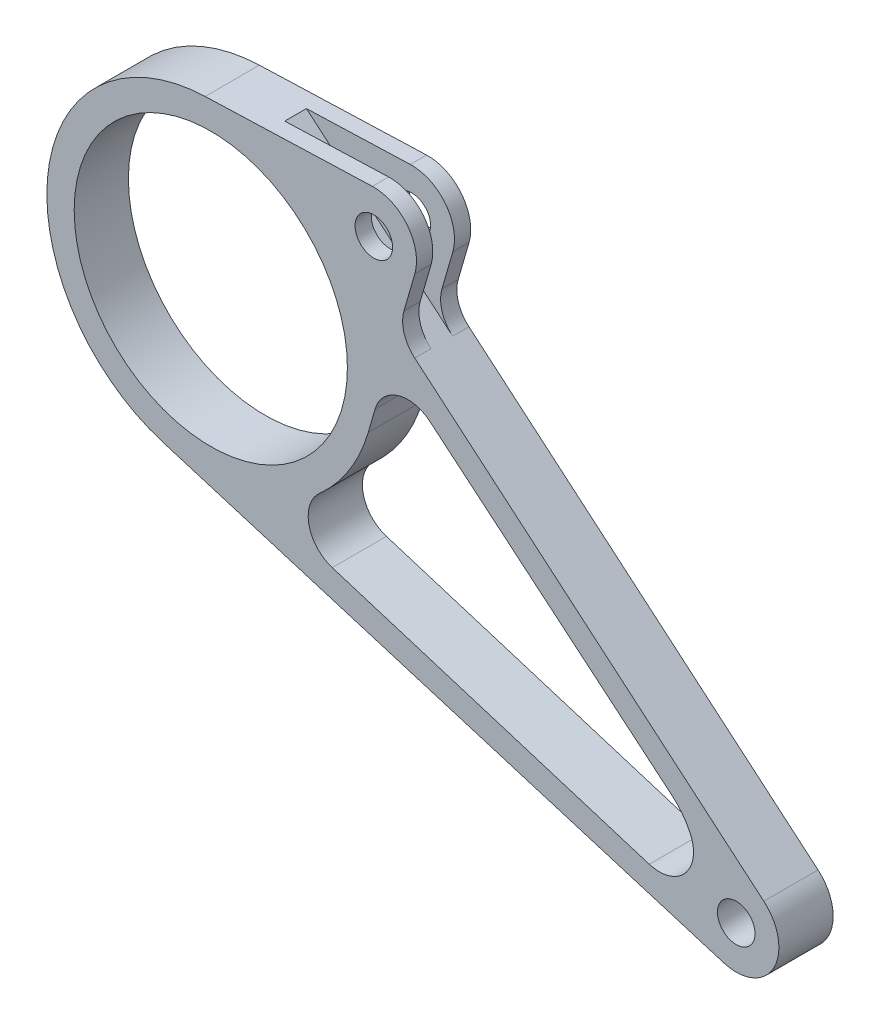
ISO-10303-21;
HEADER;
FILE_DESCRIPTION(('STEP AP214'),'2;1');
FILE_NAME('part.step','',(''),(''),'','','');
FILE_SCHEMA(('AUTOMOTIVE_DESIGN { 1 0 10303 214 1 1 1 1 }'));
ENDSEC;
DATA;
#1=APPLICATION_CONTEXT('core data for automotive mechanical design processes');
#2=APPLICATION_PROTOCOL_DEFINITION('international standard','automotive_design',2000,#1);
#3=PRODUCT_CONTEXT('',#1,'mechanical');
#4=PRODUCT('Part','Part','',(#3));
#5=PRODUCT_RELATED_PRODUCT_CATEGORY('part','',(#4));
#6=PRODUCT_DEFINITION_FORMATION('','',#4);
#7=PRODUCT_DEFINITION_CONTEXT('part definition',#1,'design');
#8=PRODUCT_DEFINITION('design','',#6,#7);
#9=PRODUCT_DEFINITION_SHAPE('','',#8);
#10=(LENGTH_UNIT() NAMED_UNIT(*) SI_UNIT(.MILLI.,.METRE.));
#11=(NAMED_UNIT(*) PLANE_ANGLE_UNIT() SI_UNIT($,.RADIAN.));
#12=(NAMED_UNIT(*) SI_UNIT($,.STERADIAN.) SOLID_ANGLE_UNIT());
#13=UNCERTAINTY_MEASURE_WITH_UNIT(LENGTH_MEASURE(1.E-05),#10,'distance_accuracy_value','');
#14=(GEOMETRIC_REPRESENTATION_CONTEXT(3) GLOBAL_UNCERTAINTY_ASSIGNED_CONTEXT((#13)) GLOBAL_UNIT_ASSIGNED_CONTEXT((#10,
#11,#12)) REPRESENTATION_CONTEXT('',''));
#15=CARTESIAN_POINT('',(0.,0.,0.));
#16=DIRECTION('',(0.,0.,1.));
#17=DIRECTION('',(1.,0.,0.));
#18=AXIS2_PLACEMENT_3D('',#15,#16,#17);
#19=CARTESIAN_POINT('',(-45.7927836164193,13.2841909151199,0.));
#20=DIRECTION('',(0.960405102550983,-0.278607320424348,0.));
#21=DIRECTION('',(0.278607320424348,0.960405102550984,0.));
#22=AXIS2_PLACEMENT_3D('',#19,#20,#21);
#23=PLANE('',#22);
#24=DIRECTION('',(0.,0.,1.));
#25=VECTOR('',#24,1.);
#26=CARTESIAN_POINT('',(-72.1062594431114,-77.4226735395391,0.));
#27=LINE('',#26,#25);
#28=CARTESIAN_POINT('',(-72.1062594431114,-77.4226735395391,15.875));
#29=VERTEX_POINT('',#28);
#30=CARTESIAN_POINT('',(-72.1062594431114,-77.4226735395391,11.1125));
#31=VERTEX_POINT('',#30);
#32=EDGE_CURVE('E393',#29,#31,#27,.F.);
#33=ORIENTED_EDGE('',*,*,#32,.T.);
#34=DIRECTION('',(0.278607320424348,0.960405102550984,0.));
#35=VECTOR('',#34,1.);
#36=CARTESIAN_POINT('',(-45.7927836164193,13.2841909151199,11.1125));
#37=LINE('',#36,#35);
#38=CARTESIAN_POINT('',(-68.9308464661694,-66.4765044973303,11.1125));
#39=VERTEX_POINT('',#38);
#40=EDGE_CURVE('E126',#31,#39,#37,.T.);
#41=ORIENTED_EDGE('',*,*,#40,.T.);
#42=DIRECTION('',(0.,0.,1.));
#43=VECTOR('',#42,1.);
#44=CARTESIAN_POINT('',(-68.9308464661694,-66.4765044973303,0.));
#45=LINE('',#44,#43);
#46=CARTESIAN_POINT('',(-68.9308464661694,-66.4765044973303,15.875));
#47=VERTEX_POINT('',#46);
#48=EDGE_CURVE('E327',#39,#47,#45,.T.);
#49=ORIENTED_EDGE('',*,*,#48,.T.);
#50=DIRECTION('',(0.278607320424348,0.960405102550983,0.));
#51=VECTOR('',#50,1.);
#52=CARTESIAN_POINT('',(-45.7927836164193,13.2841909151199,15.875));
#53=LINE('',#52,#51);
#54=EDGE_CURVE('E313',#29,#47,#53,.T.);
#55=ORIENTED_EDGE('',*,*,#54,.F.);
#56=EDGE_LOOP('',(#33,#41,#49,#55));
#57=FACE_BOUND('',#56,.T.);
#58=ADVANCED_FACE('F111',(#57),#23,.T.);
#59=CARTESIAN_POINT('',(-80.9359102480567,-62.9939129920259,0.));
#60=DIRECTION('',(0.,0.,1.));
#61=DIRECTION('',(1.,0.,0.));
#62=AXIS2_PLACEMENT_3D('',#59,#60,#61);
#63=CYLINDRICAL_SURFACE('',#62,12.5);
#64=ORIENTED_EDGE('',*,*,#48,.F.);
#65=CARTESIAN_POINT('',(-80.9359102480567,-62.9939129920259,11.1125));
#66=DIRECTION('',(0.,0.,-1.));
#67=DIRECTION('',(-1.,0.,0.));
#68=AXIS2_PLACEMENT_3D('',#65,#66,#67);
#69=CIRCLE('',#68,12.5);
#70=CARTESIAN_POINT('',(-81.36466756333,-50.5012684695639,11.1125));
#71=VERTEX_POINT('',#70);
#72=EDGE_CURVE('E281',#71,#39,#69,.T.);
#73=ORIENTED_EDGE('',*,*,#72,.F.);
#74=DIRECTION('',(0.,0.,1.));
#75=VECTOR('',#74,1.);
#76=CARTESIAN_POINT('',(-81.36466756333,-50.5012684695639,0.));
#77=LINE('',#76,#75);
#78=CARTESIAN_POINT('',(-81.36466756333,-50.5012684695639,15.875));
#79=VERTEX_POINT('',#78);
#80=EDGE_CURVE('E307',#71,#79,#77,.T.);
#81=ORIENTED_EDGE('',*,*,#80,.T.);
#82=CARTESIAN_POINT('',(-80.9359102480567,-62.9939129920259,15.875));
#83=DIRECTION('',(0.,0.,1.));
#84=DIRECTION('',(1.,0.,0.));
#85=AXIS2_PLACEMENT_3D('',#82,#83,#84);
#86=CIRCLE('',#85,12.5);
#87=EDGE_CURVE('E310',#79,#47,#86,.F.);
#88=ORIENTED_EDGE('',*,*,#87,.T.);
#89=EDGE_LOOP('',(#64,#73,#81,#88));
#90=FACE_BOUND('',#89,.T.);
#91=ADVANCED_FACE('F474',(#90),#63,.T.);
#92=CARTESIAN_POINT('',(-80.9359102480567,-62.9939129920259,0.));
#93=DIRECTION('',(0.,0.,1.));
#94=DIRECTION('',(1.,0.,0.));
#95=AXIS2_PLACEMENT_3D('',#92,#93,#94);
#96=CYLINDRICAL_SURFACE('',#95,5.5);
#97=CARTESIAN_POINT('',(-80.9359102480567,-62.9939129920259,15.875));
#98=DIRECTION('',(0.,0.,1.));
#99=DIRECTION('',(1.,0.,0.));
#100=AXIS2_PLACEMENT_3D('',#97,#98,#99);
#101=CIRCLE('',#100,5.5);
#102=CARTESIAN_POINT('',(-75.4359102480567,-62.9939129920259,15.875));
#103=VERTEX_POINT('',#102);
#104=EDGE_CURVE('E320',#103,#103,#101,.T.);
#105=ORIENTED_EDGE('',*,*,#104,.T.);
#106=EDGE_LOOP('',(#105));
#107=FACE_BOUND('',#106,.T.);
#108=CARTESIAN_POINT('',(-80.9359102480567,-62.9939129920259,11.1125));
#109=DIRECTION('',(0.,0.,-1.));
#110=DIRECTION('',(-1.,0.,0.));
#111=AXIS2_PLACEMENT_3D('',#108,#109,#110);
#112=CIRCLE('',#111,5.5);
#113=CARTESIAN_POINT('',(-86.4359102480567,-62.9939129920259,11.1125));
#114=VERTEX_POINT('',#113);
#115=EDGE_CURVE('E287',#114,#114,#112,.F.);
#116=ORIENTED_EDGE('',*,*,#115,.F.);
#117=EDGE_LOOP('',(#116));
#118=FACE_BOUND('',#117,.T.);
#119=ADVANCED_FACE('F482',(#107,#118),#96,.F.);
#120=CARTESIAN_POINT('',(-62.5022084176016,-80.2087467437826,0.));
#121=DIRECTION('',(0.,0.,1.));
#122=DIRECTION('',(1.,0.,0.));
#123=AXIS2_PLACEMENT_3D('',#120,#121,#122);
#124=CYLINDRICAL_SURFACE('',#123,10.);
#125=CARTESIAN_POINT('',(-62.5022084176016,-80.2087467437826,11.1125));
#126=DIRECTION('',(0.,0.,-1.));
#127=DIRECTION('',(-1.,0.,0.));
#128=AXIS2_PLACEMENT_3D('',#125,#126,#127);
#129=CIRCLE('',#128,10.);
#130=CARTESIAN_POINT('',(-68.9673127316795,-87.8377982056677,11.1125));
#131=VERTEX_POINT('',#130);
#132=EDGE_CURVE('E119',#31,#131,#129,.F.);
#133=ORIENTED_EDGE('',*,*,#132,.F.);
#134=ORIENTED_EDGE('',*,*,#32,.F.);
#135=CARTESIAN_POINT('',(-62.5022084176016,-80.2087467437826,15.875));
#136=DIRECTION('',(0.,0.,1.));
#137=DIRECTION('',(1.,0.,0.));
#138=AXIS2_PLACEMENT_3D('',#135,#136,#137);
#139=CIRCLE('',#138,10.);
#140=CARTESIAN_POINT('',(-68.9673127316795,-87.8377982056677,15.875));
#141=VERTEX_POINT('',#140);
#142=EDGE_CURVE('E407',#141,#29,#139,.F.);
#143=ORIENTED_EDGE('',*,*,#142,.F.);
#144=DIRECTION('',(0.,0.,1.));
#145=VECTOR('',#144,1.);
#146=CARTESIAN_POINT('',(-68.9673127316795,-87.8377982056677,0.));
#147=LINE('',#146,#145);
#148=EDGE_CURVE('E390',#131,#141,#147,.T.);
#149=ORIENTED_EDGE('',*,*,#148,.F.);
#150=EDGE_LOOP('',(#133,#134,#143,#149));
#151=FACE_BOUND('',#150,.T.);
#152=ADVANCED_FACE('F441',(#151),#124,.F.);
#153=CARTESIAN_POINT('',(-128.679206861492,-100.153402069267,15.875));
#154=DIRECTION('',(0.,0.,1.));
#155=DIRECTION('',(1.,0.,0.));
#156=AXIS2_PLACEMENT_3D('',#153,#154,#155);
#157=PLANE('',#156);
#158=ORIENTED_EDGE('',*,*,#104,.F.);
#159=EDGE_LOOP('',(#158));
#160=FACE_BOUND('',#159,.T.);
#161=DIRECTION('',(-0.766657695712818,0.642056054877074,0.));
#162=VECTOR('',#161,1.);
#163=CARTESIAN_POINT('',(-76.6631882052993,-91.5409531130822,15.875));
#164=LINE('',#163,#162);
#165=CARTESIAN_POINT('',(6.41120908182552,-161.113619091305,15.875));
#166=VERTEX_POINT('',#165);
#167=CARTESIAN_POINT('',(-64.5386730776667,-101.694921949079,15.875));
#168=VERTEX_POINT('',#167);
#169=EDGE_CURVE('E333',#166,#168,#164,.T.);
#170=ORIENTED_EDGE('',*,*,#169,.F.);
#171=CARTESIAN_POINT('',(-6.429912015716,-176.446773005562,15.875));
#172=DIRECTION('',(0.,0.,1.));
#173=DIRECTION('',(1.,0.,0.));
#174=AXIS2_PLACEMENT_3D('',#171,#172,#173);
#175=CIRCLE('',#174,20.);
#176=CARTESIAN_POINT('',(11.7808813856509,-168.178338831383,15.875));
#177=VERTEX_POINT('',#176);
#178=EDGE_CURVE('E424',#166,#177,#175,.F.);
#179=ORIENTED_EDGE('',*,*,#178,.T.);
#180=CARTESIAN_POINT('',(2.67548468496747,-172.312555918472,15.875));
#181=DIRECTION('',(0.,0.,1.));
#182=DIRECTION('',(1.,0.,0.));
#183=AXIS2_PLACEMENT_3D('',#180,#181,#182);
#184=CIRCLE('',#183,10.);
#185=CARTESIAN_POINT('',(-0.287414255686937,-181.863536489464,15.875));
#186=VERTEX_POINT('',#185);
#187=EDGE_CURVE('E134',#177,#186,#184,.F.);
#188=ORIENTED_EDGE('',*,*,#187,.T.);
#189=DIRECTION('',(-0.955098057099212,0.296289894065441,0.));
#190=VECTOR('',#189,1.);
#191=CARTESIAN_POINT('',(-51.4900483803203,-165.979488848602,15.875));
#192=LINE('',#191,#190);
#193=CARTESIAN_POINT('',(-93.1209818700245,-153.064767913065,15.875));
#194=VERTEX_POINT('',#193);
#195=EDGE_CURVE('E339',#186,#194,#192,.T.);
#196=ORIENTED_EDGE('',*,*,#195,.T.);
#197=CARTESIAN_POINT('',(-90.1580829293701,-143.513787342073,15.875));
#198=DIRECTION('',(0.,0.,1.));
#199=DIRECTION('',(1.,0.,0.));
#200=AXIS2_PLACEMENT_3D('',#197,#198,#199);
#201=CIRCLE('',#200,10.);
#202=CARTESIAN_POINT('',(-96.7996560211152,-136.037858846761,15.875));
#203=VERTEX_POINT('',#202);
#204=EDGE_CURVE('E416',#194,#203,#201,.F.);
#205=ORIENTED_EDGE('',*,*,#204,.T.);
#206=CARTESIAN_POINT('',(-128.679206861492,-100.153402069267,15.875));
#207=DIRECTION('',(0.,0.,1.));
#208=DIRECTION('',(1.,0.,0.));
#209=AXIS2_PLACEMENT_3D('',#206,#207,#208);
#210=CIRCLE('',#209,48.0000000000003);
#211=CARTESIAN_POINT('',(-82.5797619390443,-113.526553449636,15.875));
#212=VERTEX_POINT('',#211);
#213=EDGE_CURVE('E351',#203,#212,#210,.T.);
#214=ORIENTED_EDGE('',*,*,#213,.T.);
#215=DIRECTION('',(0.278607320424348,0.960405102550983,0.));
#216=VECTOR('',#215,1.);
#217=CARTESIAN_POINT('',(-45.7927836164193,13.2841909151199,15.875));
#218=LINE('',#217,#216);
#219=CARTESIAN_POINT('',(-80.5632846519473,-106.575425701964,15.875));
#220=VERTEX_POINT('',#219);
#221=EDGE_CURVE('E348',#212,#220,#218,.T.);
#222=ORIENTED_EDGE('',*,*,#221,.T.);
#223=CARTESIAN_POINT('',(-70.9592336264375,-109.361498906207,15.875));
#224=DIRECTION('',(0.,0.,1.));
#225=DIRECTION('',(1.,0.,0.));
#226=AXIS2_PLACEMENT_3D('',#223,#224,#225);
#227=CIRCLE('',#226,10.);
#228=EDGE_CURVE('E411',#220,#168,#227,.F.);
#229=ORIENTED_EDGE('',*,*,#228,.T.);
#230=EDGE_LOOP('',(#170,#179,#188,#196,#205,#214,#222,#229));
#231=FACE_BOUND('',#230,.T.);
#232=CARTESIAN_POINT('',(25.178967194243,-184.005129645085,15.875));
#233=DIRECTION('',(0.,0.,1.));
#234=DIRECTION('',(1.,0.,0.));
#235=AXIS2_PLACEMENT_3D('',#232,#233,#234);
#236=CIRCLE('',#235,5.5);
#237=CARTESIAN_POINT('',(30.678967194243,-184.005129645085,15.875));
#238=VERTEX_POINT('',#237);
#239=EDGE_CURVE('E357',#238,#238,#236,.T.);
#240=ORIENTED_EDGE('',*,*,#239,.F.);
#241=EDGE_LOOP('',(#240));
#242=FACE_BOUND('',#241,.T.);
#243=CARTESIAN_POINT('',(-128.679206861492,-100.153402069267,15.875));
#244=DIRECTION('',(0.,0.,1.));
#245=DIRECTION('',(1.,0.,0.));
#246=AXIS2_PLACEMENT_3D('',#243,#244,#245);
#247=CIRCLE('',#246,40.);
#248=CARTESIAN_POINT('',(-88.6792068614918,-100.153402069267,15.875));
#249=VERTEX_POINT('',#248);
#250=EDGE_CURVE('E363',#249,#249,#247,.T.);
#251=ORIENTED_EDGE('',*,*,#250,.F.);
#252=EDGE_LOOP('',(#251));
#253=FACE_BOUND('',#252,.T.);
#254=DIRECTION('',(0.999411561796959,0.034300585221869,0.));
#255=VECTOR('',#254,1.);
#256=CARTESIAN_POINT('',(1.63547577247302,-47.6526387370859,15.875));
#257=LINE('',#256,#255);
#258=CARTESIAN_POINT('',(-130.325634952142,-52.1816471030125,15.875));
#259=VERTEX_POINT('',#258);
#260=EDGE_CURVE('E295',#259,#79,#257,.T.);
#261=ORIENTED_EDGE('',*,*,#260,.F.);
#262=CARTESIAN_POINT('',(-128.679206861492,-100.153402069267,15.875));
#263=DIRECTION('',(0.,0.,1.));
#264=DIRECTION('',(1.,0.,0.));
#265=AXIS2_PLACEMENT_3D('',#262,#263,#264);
#266=CIRCLE('',#265,48.0000000000003);
#267=CARTESIAN_POINT('',(-142.633865887239,-146.080164326967,15.875));
#268=VERTEX_POINT('',#267);
#269=EDGE_CURVE('E369',#259,#268,#266,.T.);
#270=ORIENTED_EDGE('',*,*,#269,.T.);
#271=DIRECTION('',(0.956807547035381,-0.290722063036393,0.));
#272=VECTOR('',#271,1.);
#273=CARTESIAN_POINT('',(-142.633865887239,-146.080164326967,15.875));
#274=LINE('',#273,#272);
#275=CARTESIAN_POINT('',(21.5449414062881,-195.965223983027,15.875));
#276=VERTEX_POINT('',#275);
#277=EDGE_CURVE('E372',#268,#276,#274,.T.);
#278=ORIENTED_EDGE('',*,*,#277,.T.);
#279=CARTESIAN_POINT('',(25.178967194243,-184.005129645085,15.875));
#280=DIRECTION('',(0.,0.,1.));
#281=DIRECTION('',(1.,0.,0.));
#282=AXIS2_PLACEMENT_3D('',#279,#280,#281);
#283=CIRCLE('',#282,12.5);
#284=CARTESIAN_POINT('',(33.2603475868405,-174.468815317728,15.875));
#285=VERTEX_POINT('',#284);
#286=EDGE_CURVE('E375',#276,#285,#283,.T.);
#287=ORIENTED_EDGE('',*,*,#286,.T.);
#288=DIRECTION('',(0.762905146188508,-0.646510431407793,0.));
#289=VECTOR('',#288,1.);
#290=CARTESIAN_POINT('',(-72.1505611635108,-85.1402107962456,15.875));
#291=LINE('',#290,#289);
#292=EDGE_CURVE('E300',#141,#285,#291,.T.);
#293=ORIENTED_EDGE('',*,*,#292,.F.);
#294=ORIENTED_EDGE('',*,*,#142,.T.);
#295=ORIENTED_EDGE('',*,*,#54,.T.);
#296=ORIENTED_EDGE('',*,*,#87,.F.);
#297=EDGE_LOOP('',(#261,#270,#278,#287,#293,#294,#295,#296));
#298=FACE_BOUND('',#297,.T.);
#299=ADVANCED_FACE('F446',(#160,#231,#242,#253,#298),#157,.T.);
#300=CARTESIAN_POINT('',(-128.679206861492,-100.153402069267,0.));
#301=DIRECTION('',(0.,0.,1.));
#302=DIRECTION('',(1.,0.,0.));
#303=AXIS2_PLACEMENT_3D('',#300,#301,#302);
#304=PLANE('',#303);
#305=CARTESIAN_POINT('',(-80.9359102480567,-62.9939129920259,0.));
#306=DIRECTION('',(0.,0.,1.));
#307=DIRECTION('',(1.,0.,0.));
#308=AXIS2_PLACEMENT_3D('',#305,#306,#307);
#309=CIRCLE('',#308,5.5);
#310=CARTESIAN_POINT('',(-75.4359102480567,-62.9939129920259,0.));
#311=VERTEX_POINT('',#310);
#312=EDGE_CURVE('E330',#311,#311,#309,.T.);
#313=ORIENTED_EDGE('',*,*,#312,.T.);
#314=EDGE_LOOP('',(#313));
#315=FACE_BOUND('',#314,.T.);
#316=DIRECTION('',(-0.955098057099212,0.296289894065441,0.));
#317=VECTOR('',#316,1.);
#318=CARTESIAN_POINT('',(-51.4900483803203,-165.979488848602,0.));
#319=LINE('',#318,#317);
#320=CARTESIAN_POINT('',(-0.287414255686937,-181.863536489464,0.));
#321=VERTEX_POINT('',#320);
#322=CARTESIAN_POINT('',(-93.1209818700245,-153.064767913065,0.));
#323=VERTEX_POINT('',#322);
#324=EDGE_CURVE('E344',#321,#323,#319,.T.);
#325=ORIENTED_EDGE('',*,*,#324,.F.);
#326=CARTESIAN_POINT('',(2.67548468496747,-172.312555918472,0.));
#327=DIRECTION('',(0.,0.,1.));
#328=DIRECTION('',(1.,0.,0.));
#329=AXIS2_PLACEMENT_3D('',#326,#327,#328);
#330=CIRCLE('',#329,10.);
#331=CARTESIAN_POINT('',(11.7808813856509,-168.178338831383,0.));
#332=VERTEX_POINT('',#331);
#333=EDGE_CURVE('E434',#321,#332,#330,.T.);
#334=ORIENTED_EDGE('',*,*,#333,.T.);
#335=CARTESIAN_POINT('',(-6.429912015716,-176.446773005562,0.));
#336=DIRECTION('',(0.,0.,1.));
#337=DIRECTION('',(1.,0.,0.));
#338=AXIS2_PLACEMENT_3D('',#335,#336,#337);
#339=CIRCLE('',#338,20.);
#340=CARTESIAN_POINT('',(6.41120908182552,-161.113619091305,0.));
#341=VERTEX_POINT('',#340);
#342=EDGE_CURVE('E426',#332,#341,#339,.T.);
#343=ORIENTED_EDGE('',*,*,#342,.T.);
#344=DIRECTION('',(-0.766657695712818,0.642056054877074,0.));
#345=VECTOR('',#344,1.);
#346=CARTESIAN_POINT('',(-76.6631882052993,-91.5409531130822,0.));
#347=LINE('',#346,#345);
#348=CARTESIAN_POINT('',(-64.5386730776667,-101.694921949079,0.));
#349=VERTEX_POINT('',#348);
#350=EDGE_CURVE('E336',#341,#349,#347,.T.);
#351=ORIENTED_EDGE('',*,*,#350,.T.);
#352=CARTESIAN_POINT('',(-70.9592336264375,-109.361498906207,0.));
#353=DIRECTION('',(0.,0.,1.));
#354=DIRECTION('',(1.,0.,0.));
#355=AXIS2_PLACEMENT_3D('',#352,#353,#354);
#356=CIRCLE('',#355,10.);
#357=CARTESIAN_POINT('',(-80.5632846519473,-106.575425701964,0.));
#358=VERTEX_POINT('',#357);
#359=EDGE_CURVE('E414',#349,#358,#356,.T.);
#360=ORIENTED_EDGE('',*,*,#359,.T.);
#361=DIRECTION('',(0.278607320424348,0.960405102550983,0.));
#362=VECTOR('',#361,1.);
#363=CARTESIAN_POINT('',(-45.7927836164193,13.2841909151199,0.));
#364=LINE('',#363,#362);
#365=CARTESIAN_POINT('',(-82.5797619390443,-113.526553449636,0.));
#366=VERTEX_POINT('',#365);
#367=EDGE_CURVE('E338',#366,#358,#364,.T.);
#368=ORIENTED_EDGE('',*,*,#367,.F.);
#369=CARTESIAN_POINT('',(-128.679206861492,-100.153402069267,0.));
#370=DIRECTION('',(0.,0.,1.));
#371=DIRECTION('',(1.,0.,0.));
#372=AXIS2_PLACEMENT_3D('',#369,#370,#371);
#373=CIRCLE('',#372,48.0000000000003);
#374=CARTESIAN_POINT('',(-96.7996560211152,-136.037858846761,0.));
#375=VERTEX_POINT('',#374);
#376=EDGE_CURVE('E342',#375,#366,#373,.T.);
#377=ORIENTED_EDGE('',*,*,#376,.F.);
#378=CARTESIAN_POINT('',(-90.1580829293701,-143.513787342073,0.));
#379=DIRECTION('',(0.,0.,1.));
#380=DIRECTION('',(1.,0.,0.));
#381=AXIS2_PLACEMENT_3D('',#378,#379,#380);
#382=CIRCLE('',#381,10.);
#383=EDGE_CURVE('E418',#375,#323,#382,.T.);
#384=ORIENTED_EDGE('',*,*,#383,.T.);
#385=EDGE_LOOP('',(#325,#334,#343,#351,#360,#368,#377,#384));
#386=FACE_BOUND('',#385,.T.);
#387=CARTESIAN_POINT('',(-128.679206861492,-100.153402069267,0.));
#388=DIRECTION('',(0.,0.,1.));
#389=DIRECTION('',(1.,0.,0.));
#390=AXIS2_PLACEMENT_3D('',#387,#388,#389);
#391=CIRCLE('',#390,40.);
#392=CARTESIAN_POINT('',(-88.6792068614918,-100.153402069267,0.));
#393=VERTEX_POINT('',#392);
#394=EDGE_CURVE('E360',#393,#393,#391,.T.);
#395=ORIENTED_EDGE('',*,*,#394,.T.);
#396=EDGE_LOOP('',(#395));
#397=FACE_BOUND('',#396,.T.);
#398=CARTESIAN_POINT('',(25.178967194243,-184.005129645085,0.));
#399=DIRECTION('',(0.,0.,1.));
#400=DIRECTION('',(1.,0.,0.));
#401=AXIS2_PLACEMENT_3D('',#398,#399,#400);
#402=CIRCLE('',#401,5.5);
#403=CARTESIAN_POINT('',(30.678967194243,-184.005129645085,0.));
#404=VERTEX_POINT('',#403);
#405=EDGE_CURVE('E356',#404,#404,#402,.T.);
#406=ORIENTED_EDGE('',*,*,#405,.T.);
#407=EDGE_LOOP('',(#406));
#408=FACE_BOUND('',#407,.T.);
#409=CARTESIAN_POINT('',(-128.679206861492,-100.153402069267,0.));
#410=DIRECTION('',(0.,0.,1.));
#411=DIRECTION('',(1.,0.,0.));
#412=AXIS2_PLACEMENT_3D('',#409,#410,#411);
#413=CIRCLE('',#412,48.0000000000003);
#414=CARTESIAN_POINT('',(-130.325634952142,-52.1816471030125,0.));
#415=VERTEX_POINT('',#414);
#416=CARTESIAN_POINT('',(-142.633865887239,-146.080164326967,0.));
#417=VERTEX_POINT('',#416);
#418=EDGE_CURVE('E366',#415,#417,#413,.T.);
#419=ORIENTED_EDGE('',*,*,#418,.F.);
#420=DIRECTION('',(0.999411561796959,0.034300585221869,0.));
#421=VECTOR('',#420,1.);
#422=CARTESIAN_POINT('',(1.63547577247302,-47.6526387370859,0.));
#423=LINE('',#422,#421);
#424=CARTESIAN_POINT('',(-81.36466756333,-50.5012684695639,0.));
#425=VERTEX_POINT('',#424);
#426=EDGE_CURVE('E296',#415,#425,#423,.T.);
#427=ORIENTED_EDGE('',*,*,#426,.T.);
#428=CARTESIAN_POINT('',(-80.9359102480567,-62.9939129920259,0.));
#429=DIRECTION('',(0.,0.,1.));
#430=DIRECTION('',(1.,0.,0.));
#431=AXIS2_PLACEMENT_3D('',#428,#429,#430);
#432=CIRCLE('',#431,12.5);
#433=CARTESIAN_POINT('',(-68.9308464661694,-66.4765044973303,0.));
#434=VERTEX_POINT('',#433);
#435=EDGE_CURVE('E299',#425,#434,#432,.F.);
#436=ORIENTED_EDGE('',*,*,#435,.T.);
#437=DIRECTION('',(0.278607320424348,0.960405102550983,0.));
#438=VECTOR('',#437,1.);
#439=CARTESIAN_POINT('',(-45.7927836164193,13.2841909151199,0.));
#440=LINE('',#439,#438);
#441=CARTESIAN_POINT('',(-72.1062594431114,-77.4226735395391,0.));
#442=VERTEX_POINT('',#441);
#443=EDGE_CURVE('E303',#442,#434,#440,.T.);
#444=ORIENTED_EDGE('',*,*,#443,.F.);
#445=CARTESIAN_POINT('',(-62.5022084176016,-80.2087467437826,0.));
#446=DIRECTION('',(0.,0.,1.));
#447=DIRECTION('',(1.,0.,0.));
#448=AXIS2_PLACEMENT_3D('',#445,#446,#447);
#449=CIRCLE('',#448,10.);
#450=CARTESIAN_POINT('',(-68.9673127316795,-87.8377982056677,0.));
#451=VERTEX_POINT('',#450);
#452=EDGE_CURVE('E409',#442,#451,#449,.T.);
#453=ORIENTED_EDGE('',*,*,#452,.T.);
#454=DIRECTION('',(0.762905146188508,-0.646510431407793,0.));
#455=VECTOR('',#454,1.);
#456=CARTESIAN_POINT('',(-72.1505611635108,-85.1402107962456,0.));
#457=LINE('',#456,#455);
#458=CARTESIAN_POINT('',(33.2603475868405,-174.468815317728,0.));
#459=VERTEX_POINT('',#458);
#460=EDGE_CURVE('E305',#451,#459,#457,.T.);
#461=ORIENTED_EDGE('',*,*,#460,.T.);
#462=CARTESIAN_POINT('',(25.178967194243,-184.005129645085,0.));
#463=DIRECTION('',(0.,0.,1.));
#464=DIRECTION('',(1.,0.,0.));
#465=AXIS2_PLACEMENT_3D('',#462,#463,#464);
#466=CIRCLE('',#465,12.5);
#467=CARTESIAN_POINT('',(21.5449414062881,-195.965223983027,0.));
#468=VERTEX_POINT('',#467);
#469=EDGE_CURVE('E373',#468,#459,#466,.T.);
#470=ORIENTED_EDGE('',*,*,#469,.F.);
#471=DIRECTION('',(0.956807547035381,-0.290722063036393,0.));
#472=VECTOR('',#471,1.);
#473=CARTESIAN_POINT('',(-142.633865887239,-146.080164326967,0.));
#474=LINE('',#473,#472);
#475=EDGE_CURVE('E381',#417,#468,#474,.T.);
#476=ORIENTED_EDGE('',*,*,#475,.F.);
#477=EDGE_LOOP('',(#419,#427,#436,#444,#453,#461,#470,#476));
#478=FACE_BOUND('',#477,.T.);
#479=ADVANCED_FACE('F454',(#315,#386,#397,#408,#478),#304,.F.);
#480=CARTESIAN_POINT('',(-128.679206861492,-100.153402069267,15.875));
#481=DIRECTION('',(0.,0.,-1.));
#482=DIRECTION('',(-1.,0.,0.));
#483=AXIS2_PLACEMENT_3D('',#480,#481,#482);
#484=CYLINDRICAL_SURFACE('',#483,48.0000000000003);
#485=ORIENTED_EDGE('',*,*,#418,.T.);
#486=DIRECTION('',(0.,0.,-1.));
#487=VECTOR('',#486,1.);
#488=CARTESIAN_POINT('',(-142.633865887239,-146.080164326967,15.875));
#489=LINE('',#488,#487);
#490=EDGE_CURVE('E387',#268,#417,#489,.T.);
#491=ORIENTED_EDGE('',*,*,#490,.F.);
#492=ORIENTED_EDGE('',*,*,#269,.F.);
#493=DIRECTION('',(0.,0.,1.));
#494=VECTOR('',#493,1.);
#495=CARTESIAN_POINT('',(-130.325634952142,-52.1816471030125,0.));
#496=LINE('',#495,#494);
#497=EDGE_CURVE('E317',#415,#259,#496,.T.);
#498=ORIENTED_EDGE('',*,*,#497,.F.);
#499=EDGE_LOOP('',(#485,#491,#492,#498));
#500=FACE_BOUND('',#499,.T.);
#501=ADVANCED_FACE('F568',(#500),#484,.T.);
#502=CARTESIAN_POINT('',(-142.633865887239,-146.080164326967,15.875));
#503=DIRECTION('',(0.290722063036393,0.956807547035381,0.));
#504=DIRECTION('',(-0.956807547035382,0.290722063036393,0.));
#505=AXIS2_PLACEMENT_3D('',#502,#503,#504);
#506=PLANE('',#505);
#507=ORIENTED_EDGE('',*,*,#475,.T.);
#508=DIRECTION('',(0.,0.,-1.));
#509=VECTOR('',#508,1.);
#510=CARTESIAN_POINT('',(21.5449414062881,-195.965223983027,15.875));
#511=LINE('',#510,#509);
#512=EDGE_CURVE('E378',#276,#468,#511,.T.);
#513=ORIENTED_EDGE('',*,*,#512,.F.);
#514=ORIENTED_EDGE('',*,*,#277,.F.);
#515=ORIENTED_EDGE('',*,*,#490,.T.);
#516=EDGE_LOOP('',(#507,#513,#514,#515));
#517=FACE_BOUND('',#516,.T.);
#518=ADVANCED_FACE('F572',(#517),#506,.F.);
#519=CARTESIAN_POINT('',(25.178967194243,-184.005129645085,15.875));
#520=DIRECTION('',(0.,0.,-1.));
#521=DIRECTION('',(-1.,0.,0.));
#522=AXIS2_PLACEMENT_3D('',#519,#520,#521);
#523=CYLINDRICAL_SURFACE('',#522,12.5);
#524=ORIENTED_EDGE('',*,*,#469,.T.);
#525=DIRECTION('',(0.,0.,1.));
#526=VECTOR('',#525,1.);
#527=CARTESIAN_POINT('',(33.2603475868405,-174.468815317728,0.));
#528=LINE('',#527,#526);
#529=EDGE_CURVE('E321',#459,#285,#528,.T.);
#530=ORIENTED_EDGE('',*,*,#529,.T.);
#531=ORIENTED_EDGE('',*,*,#286,.F.);
#532=ORIENTED_EDGE('',*,*,#512,.T.);
#533=EDGE_LOOP('',(#524,#530,#531,#532));
#534=FACE_BOUND('',#533,.T.);
#535=ADVANCED_FACE('F450',(#534),#523,.T.);
#536=CARTESIAN_POINT('',(-128.679206861492,-100.153402069267,15.875));
#537=DIRECTION('',(0.,0.,-1.));
#538=DIRECTION('',(-1.,0.,0.));
#539=AXIS2_PLACEMENT_3D('',#536,#537,#538);
#540=CYLINDRICAL_SURFACE('',#539,40.);
#541=ORIENTED_EDGE('',*,*,#250,.T.);
#542=EDGE_LOOP('',(#541));
#543=FACE_BOUND('',#542,.T.);
#544=ORIENTED_EDGE('',*,*,#394,.F.);
#545=EDGE_LOOP('',(#544));
#546=FACE_BOUND('',#545,.T.);
#547=ADVANCED_FACE('F558',(#543,#546),#540,.F.);
#548=CARTESIAN_POINT('',(25.178967194243,-184.005129645085,15.875));
#549=DIRECTION('',(0.,0.,-1.));
#550=DIRECTION('',(-1.,0.,0.));
#551=AXIS2_PLACEMENT_3D('',#548,#549,#550);
#552=CYLINDRICAL_SURFACE('',#551,5.5);
#553=ORIENTED_EDGE('',*,*,#239,.T.);
#554=EDGE_LOOP('',(#553));
#555=FACE_BOUND('',#554,.T.);
#556=ORIENTED_EDGE('',*,*,#405,.F.);
#557=EDGE_LOOP('',(#556));
#558=FACE_BOUND('',#557,.T.);
#559=ADVANCED_FACE('F494',(#555,#558),#552,.F.);
#560=CARTESIAN_POINT('',(1.63547577247302,-47.6526387370859,0.));
#561=DIRECTION('',(0.034300585221869,-0.999411561796959,0.));
#562=DIRECTION('',(0.999411561796959,0.034300585221869,0.));
#563=AXIS2_PLACEMENT_3D('',#560,#561,#562);
#564=PLANE('',#563);
#565=DIRECTION('',(0.,0.,1.));
#566=VECTOR('',#565,1.);
#567=CARTESIAN_POINT('',(-111.793381855921,-51.5456057052752,4.7625));
#568=LINE('',#567,#566);
#569=CARTESIAN_POINT('',(-111.793381855921,-51.5456057052752,4.7625));
#570=VERTEX_POINT('',#569);
#571=CARTESIAN_POINT('',(-111.793381855921,-51.5456057052752,11.1125));
#572=VERTEX_POINT('',#571);
#573=EDGE_CURVE('E269',#570,#572,#568,.T.);
#574=ORIENTED_EDGE('',*,*,#573,.F.);
#575=DIRECTION('',(0.999411561796959,0.034300585221869,0.));
#576=VECTOR('',#575,1.);
#577=CARTESIAN_POINT('',(1.63547577247302,-47.6526387370859,4.7625));
#578=LINE('',#577,#576);
#579=CARTESIAN_POINT('',(-81.36466756333,-50.5012684695639,4.7625));
#580=VERTEX_POINT('',#579);
#581=EDGE_CURVE('E253',#570,#580,#578,.T.);
#582=ORIENTED_EDGE('',*,*,#581,.T.);
#583=EDGE_CURVE('E328',#425,#580,#77,.T.);
#584=ORIENTED_EDGE('',*,*,#583,.F.);
#585=ORIENTED_EDGE('',*,*,#426,.F.);
#586=ORIENTED_EDGE('',*,*,#497,.T.);
#587=ORIENTED_EDGE('',*,*,#260,.T.);
#588=ORIENTED_EDGE('',*,*,#80,.F.);
#589=DIRECTION('',(0.999411561796959,0.034300585221869,0.));
#590=VECTOR('',#589,1.);
#591=CARTESIAN_POINT('',(1.63547577247302,-47.6526387370859,11.1125));
#592=LINE('',#591,#590);
#593=EDGE_CURVE('E279',#572,#71,#592,.T.);
#594=ORIENTED_EDGE('',*,*,#593,.F.);
#595=EDGE_LOOP('',(#574,#582,#584,#585,#586,#587,#588,#594));
#596=FACE_BOUND('',#595,.T.);
#597=ADVANCED_FACE('F277',(#596),#564,.F.);
#598=CARTESIAN_POINT('',(-72.1505611635108,-85.1402107962456,0.));
#599=DIRECTION('',(-0.646510431407793,-0.762905146188508,0.));
#600=DIRECTION('',(0.762905146188508,-0.646510431407793,0.));
#601=AXIS2_PLACEMENT_3D('',#598,#599,#600);
#602=PLANE('',#601);
#603=CARTESIAN_POINT('',(-68.9673127316795,-87.8377982056677,4.7625));
#604=VERTEX_POINT('',#603);
#605=EDGE_CURVE('E273',#451,#604,#147,.T.);
#606=ORIENTED_EDGE('',*,*,#605,.T.);
#607=DIRECTION('',(0.762905146188509,-0.646510431407793,0.));
#608=VECTOR('',#607,1.);
#609=CARTESIAN_POINT('',(-61.2495713055312,-94.3780612565084,4.7625));
#610=LINE('',#609,#608);
#611=EDGE_CURVE('E257',#570,#604,#610,.T.);
#612=ORIENTED_EDGE('',*,*,#611,.F.);
#613=ORIENTED_EDGE('',*,*,#573,.T.);
#614=DIRECTION('',(0.762905146188509,-0.646510431407793,0.));
#615=VECTOR('',#614,1.);
#616=CARTESIAN_POINT('',(-61.2495713055312,-94.3780612565084,11.1125));
#617=LINE('',#616,#615);
#618=EDGE_CURVE('E274',#572,#131,#617,.T.);
#619=ORIENTED_EDGE('',*,*,#618,.T.);
#620=ORIENTED_EDGE('',*,*,#148,.T.);
#621=ORIENTED_EDGE('',*,*,#292,.T.);
#622=ORIENTED_EDGE('',*,*,#529,.F.);
#623=ORIENTED_EDGE('',*,*,#460,.F.);
#624=EDGE_LOOP('',(#606,#612,#613,#619,#620,#621,#622,#623));
#625=FACE_BOUND('',#624,.T.);
#626=ADVANCED_FACE('F267',(#625),#602,.F.);
#627=DIRECTION('',(0.278607320424348,0.960405102550984,0.));
#628=VECTOR('',#627,1.);
#629=CARTESIAN_POINT('',(-45.7927836164193,13.2841909151199,4.7625));
#630=LINE('',#629,#628);
#631=CARTESIAN_POINT('',(-72.1062594431114,-77.4226735395391,4.7625));
#632=VERTEX_POINT('',#631);
#633=CARTESIAN_POINT('',(-68.9308464661694,-66.4765044973303,4.7625));
#634=VERTEX_POINT('',#633);
#635=EDGE_CURVE('E290',#632,#634,#630,.T.);
#636=ORIENTED_EDGE('',*,*,#635,.F.);
#637=EDGE_CURVE('E392',#632,#442,#27,.F.);
#638=ORIENTED_EDGE('',*,*,#637,.T.);
#639=ORIENTED_EDGE('',*,*,#443,.T.);
#640=EDGE_CURVE('E324',#434,#634,#45,.T.);
#641=ORIENTED_EDGE('',*,*,#640,.T.);
#642=EDGE_LOOP('',(#636,#638,#639,#641));
#643=FACE_BOUND('',#642,.T.);
#644=ADVANCED_FACE('F462',(#643),#23,.T.);
#645=CARTESIAN_POINT('',(-80.9359102480567,-62.9939129920259,4.7625));
#646=DIRECTION('',(0.,0.,-1.));
#647=DIRECTION('',(-1.,0.,0.));
#648=AXIS2_PLACEMENT_3D('',#645,#646,#647);
#649=CIRCLE('',#648,12.5);
#650=EDGE_CURVE('E259',#580,#634,#649,.T.);
#651=ORIENTED_EDGE('',*,*,#650,.T.);
#652=ORIENTED_EDGE('',*,*,#640,.F.);
#653=ORIENTED_EDGE('',*,*,#435,.F.);
#654=ORIENTED_EDGE('',*,*,#583,.T.);
#655=EDGE_LOOP('',(#651,#652,#653,#654));
#656=FACE_BOUND('',#655,.T.);
#657=ADVANCED_FACE('F466',(#656),#63,.T.);
#658=CARTESIAN_POINT('',(-51.4900483803203,-165.979488848602,0.));
#659=DIRECTION('',(0.296289894065441,0.955098057099212,0.));
#660=DIRECTION('',(-0.955098057099212,0.296289894065441,0.));
#661=AXIS2_PLACEMENT_3D('',#658,#659,#660);
#662=PLANE('',#661);
#663=ORIENTED_EDGE('',*,*,#195,.F.);
#664=DIRECTION('',(0.,0.,1.));
#665=VECTOR('',#664,1.);
#666=CARTESIAN_POINT('',(-0.287414255686937,-181.863536489464,0.));
#667=LINE('',#666,#665);
#668=EDGE_CURVE('E431',#186,#321,#667,.F.);
#669=ORIENTED_EDGE('',*,*,#668,.T.);
#670=ORIENTED_EDGE('',*,*,#324,.T.);
#671=DIRECTION('',(0.,0.,-1.));
#672=VECTOR('',#671,1.);
#673=CARTESIAN_POINT('',(-93.1209818700245,-153.064767913065,15.875));
#674=LINE('',#673,#672);
#675=EDGE_CURVE('E402',#323,#194,#674,.F.);
#676=ORIENTED_EDGE('',*,*,#675,.T.);
#677=EDGE_LOOP('',(#663,#669,#670,#676));
#678=FACE_BOUND('',#677,.T.);
#679=ADVANCED_FACE('F490',(#678),#662,.T.);
#680=CARTESIAN_POINT('',(-128.679206861492,-100.153402069267,0.));
#681=DIRECTION('',(0.,0.,1.));
#682=DIRECTION('',(1.,0.,0.));
#683=AXIS2_PLACEMENT_3D('',#680,#681,#682);
#684=CYLINDRICAL_SURFACE('',#683,48.0000000000003);
#685=ORIENTED_EDGE('',*,*,#213,.F.);
#686=DIRECTION('',(0.,0.,1.));
#687=VECTOR('',#686,1.);
#688=CARTESIAN_POINT('',(-96.7996560211152,-136.037858846761,0.));
#689=LINE('',#688,#687);
#690=EDGE_CURVE('E405',#203,#375,#689,.F.);
#691=ORIENTED_EDGE('',*,*,#690,.T.);
#692=ORIENTED_EDGE('',*,*,#376,.T.);
#693=DIRECTION('',(0.,0.,1.));
#694=VECTOR('',#693,1.);
#695=CARTESIAN_POINT('',(-82.5797619390443,-113.526553449636,0.));
#696=LINE('',#695,#694);
#697=EDGE_CURVE('E346',#366,#212,#696,.T.);
#698=ORIENTED_EDGE('',*,*,#697,.T.);
#699=EDGE_LOOP('',(#685,#691,#692,#698));
#700=FACE_BOUND('',#699,.T.);
#701=ADVANCED_FACE('F536',(#700),#684,.T.);
#702=CARTESIAN_POINT('',(-45.7927836164193,13.2841909151199,0.));
#703=DIRECTION('',(0.960405102550983,-0.278607320424348,0.));
#704=DIRECTION('',(0.278607320424348,0.960405102550984,0.));
#705=AXIS2_PLACEMENT_3D('',#702,#703,#704);
#706=PLANE('',#705);
#707=ORIENTED_EDGE('',*,*,#367,.T.);
#708=DIRECTION('',(0.,0.,1.));
#709=VECTOR('',#708,1.);
#710=CARTESIAN_POINT('',(-80.5632846519473,-106.575425701964,0.));
#711=LINE('',#710,#709);
#712=EDGE_CURVE('E396',#358,#220,#711,.T.);
#713=ORIENTED_EDGE('',*,*,#712,.T.);
#714=ORIENTED_EDGE('',*,*,#221,.F.);
#715=ORIENTED_EDGE('',*,*,#697,.F.);
#716=EDGE_LOOP('',(#707,#713,#714,#715));
#717=FACE_BOUND('',#716,.T.);
#718=ADVANCED_FACE('F533',(#717),#706,.T.);
#719=CARTESIAN_POINT('',(-76.6631882052993,-91.5409531130822,0.));
#720=DIRECTION('',(0.642056054877074,0.766657695712818,0.));
#721=DIRECTION('',(-0.766657695712818,0.642056054877074,0.));
#722=AXIS2_PLACEMENT_3D('',#719,#720,#721);
#723=PLANE('',#722);
#724=ORIENTED_EDGE('',*,*,#350,.F.);
#725=DIRECTION('',(0.,0.,1.));
#726=VECTOR('',#725,1.);
#727=CARTESIAN_POINT('',(6.41120908182548,-161.113619091305,0.));
#728=LINE('',#727,#726);
#729=EDGE_CURVE('E421',#341,#166,#728,.T.);
#730=ORIENTED_EDGE('',*,*,#729,.T.);
#731=ORIENTED_EDGE('',*,*,#169,.T.);
#732=DIRECTION('',(0.,0.,1.));
#733=VECTOR('',#732,1.);
#734=CARTESIAN_POINT('',(-64.5386730776667,-101.694921949079,0.));
#735=LINE('',#734,#733);
#736=EDGE_CURVE('E399',#168,#349,#735,.F.);
#737=ORIENTED_EDGE('',*,*,#736,.T.);
#738=EDGE_LOOP('',(#724,#730,#731,#737));
#739=FACE_BOUND('',#738,.T.);
#740=ADVANCED_FACE('F521',(#739),#723,.F.);
#741=CARTESIAN_POINT('',(-80.9359102480567,-62.9939129920259,4.7625));
#742=DIRECTION('',(0.,0.,-1.));
#743=DIRECTION('',(-1.,0.,0.));
#744=AXIS2_PLACEMENT_3D('',#741,#742,#743);
#745=CIRCLE('',#744,5.5);
#746=CARTESIAN_POINT('',(-86.4359102480567,-62.9939129920259,4.7625));
#747=VERTEX_POINT('',#746);
#748=EDGE_CURVE('E263',#747,#747,#745,.F.);
#749=ORIENTED_EDGE('',*,*,#748,.T.);
#750=EDGE_LOOP('',(#749));
#751=FACE_BOUND('',#750,.T.);
#752=ORIENTED_EDGE('',*,*,#312,.F.);
#753=EDGE_LOOP('',(#752));
#754=FACE_BOUND('',#753,.T.);
#755=ADVANCED_FACE('F550',(#751,#754),#96,.F.);
#756=ORIENTED_EDGE('',*,*,#637,.F.);
#757=CARTESIAN_POINT('',(-62.5022084176016,-80.2087467437826,4.7625));
#758=DIRECTION('',(0.,0.,-1.));
#759=DIRECTION('',(-1.,0.,0.));
#760=AXIS2_PLACEMENT_3D('',#757,#758,#759);
#761=CIRCLE('',#760,10.);
#762=EDGE_CURVE('E12',#632,#604,#761,.F.);
#763=ORIENTED_EDGE('',*,*,#762,.T.);
#764=ORIENTED_EDGE('',*,*,#605,.F.);
#765=ORIENTED_EDGE('',*,*,#452,.F.);
#766=EDGE_LOOP('',(#756,#763,#764,#765));
#767=FACE_BOUND('',#766,.T.);
#768=ADVANCED_FACE('F459',(#767),#124,.F.);
#769=CARTESIAN_POINT('',(-70.9592336264375,-109.361498906207,0.));
#770=DIRECTION('',(0.,0.,1.));
#771=DIRECTION('',(1.,0.,0.));
#772=AXIS2_PLACEMENT_3D('',#769,#770,#771);
#773=CYLINDRICAL_SURFACE('',#772,10.);
#774=ORIENTED_EDGE('',*,*,#359,.F.);
#775=ORIENTED_EDGE('',*,*,#736,.F.);
#776=ORIENTED_EDGE('',*,*,#228,.F.);
#777=ORIENTED_EDGE('',*,*,#712,.F.);
#778=EDGE_LOOP('',(#774,#775,#776,#777));
#779=FACE_BOUND('',#778,.T.);
#780=ADVANCED_FACE('F528',(#779),#773,.F.);
#781=CARTESIAN_POINT('',(-90.1580829293701,-143.513787342073,0.));
#782=DIRECTION('',(0.,0.,1.));
#783=DIRECTION('',(1.,0.,0.));
#784=AXIS2_PLACEMENT_3D('',#781,#782,#783);
#785=CYLINDRICAL_SURFACE('',#784,10.);
#786=ORIENTED_EDGE('',*,*,#383,.F.);
#787=ORIENTED_EDGE('',*,*,#690,.F.);
#788=ORIENTED_EDGE('',*,*,#204,.F.);
#789=ORIENTED_EDGE('',*,*,#675,.F.);
#790=EDGE_LOOP('',(#786,#787,#788,#789));
#791=FACE_BOUND('',#790,.T.);
#792=ADVANCED_FACE('F508',(#791),#785,.F.);
#793=CARTESIAN_POINT('',(-6.429912015716,-176.446773005562,0.));
#794=DIRECTION('',(0.,0.,1.));
#795=DIRECTION('',(1.,0.,0.));
#796=AXIS2_PLACEMENT_3D('',#793,#794,#795);
#797=CYLINDRICAL_SURFACE('',#796,20.);
#798=ORIENTED_EDGE('',*,*,#342,.F.);
#799=DIRECTION('',(0.,0.,1.));
#800=VECTOR('',#799,1.);
#801=CARTESIAN_POINT('',(11.7808813856509,-168.178338831383,0.));
#802=LINE('',#801,#800);
#803=EDGE_CURVE('E428',#332,#177,#802,.T.);
#804=ORIENTED_EDGE('',*,*,#803,.T.);
#805=ORIENTED_EDGE('',*,*,#178,.F.);
#806=ORIENTED_EDGE('',*,*,#729,.F.);
#807=EDGE_LOOP('',(#798,#804,#805,#806));
#808=FACE_BOUND('',#807,.T.);
#809=ADVANCED_FACE('F503',(#808),#797,.F.);
#810=CARTESIAN_POINT('',(2.67548468496747,-172.312555918472,0.));
#811=DIRECTION('',(0.,0.,1.));
#812=DIRECTION('',(1.,0.,0.));
#813=AXIS2_PLACEMENT_3D('',#810,#811,#812);
#814=CYLINDRICAL_SURFACE('',#813,10.);
#815=ORIENTED_EDGE('',*,*,#333,.F.);
#816=ORIENTED_EDGE('',*,*,#668,.F.);
#817=ORIENTED_EDGE('',*,*,#187,.F.);
#818=ORIENTED_EDGE('',*,*,#803,.F.);
#819=EDGE_LOOP('',(#815,#816,#817,#818));
#820=FACE_BOUND('',#819,.T.);
#821=ADVANCED_FACE('F113',(#820),#814,.F.);
#822=CARTESIAN_POINT('',(0.,0.,4.7625));
#823=DIRECTION('',(0.,0.,-1.));
#824=DIRECTION('',(-1.,0.,0.));
#825=AXIS2_PLACEMENT_3D('',#822,#823,#824);
#826=PLANE('',#825);
#827=ORIENTED_EDGE('',*,*,#611,.T.);
#828=ORIENTED_EDGE('',*,*,#762,.F.);
#829=ORIENTED_EDGE('',*,*,#635,.T.);
#830=ORIENTED_EDGE('',*,*,#650,.F.);
#831=ORIENTED_EDGE('',*,*,#581,.F.);
#832=EDGE_LOOP('',(#827,#828,#829,#830,#831));
#833=FACE_BOUND('',#832,.T.);
#834=ORIENTED_EDGE('',*,*,#748,.F.);
#835=EDGE_LOOP('',(#834));
#836=FACE_BOUND('',#835,.T.);
#837=ADVANCED_FACE('F255',(#833,#836),#826,.F.);
#838=CARTESIAN_POINT('',(0.,0.,11.1125));
#839=DIRECTION('',(0.,0.,-1.));
#840=DIRECTION('',(-1.,0.,0.));
#841=AXIS2_PLACEMENT_3D('',#838,#839,#840);
#842=PLANE('',#841);
#843=ORIENTED_EDGE('',*,*,#593,.T.);
#844=ORIENTED_EDGE('',*,*,#72,.T.);
#845=ORIENTED_EDGE('',*,*,#40,.F.);
#846=ORIENTED_EDGE('',*,*,#132,.T.);
#847=ORIENTED_EDGE('',*,*,#618,.F.);
#848=EDGE_LOOP('',(#843,#844,#845,#846,#847));
#849=FACE_BOUND('',#848,.T.);
#850=ORIENTED_EDGE('',*,*,#115,.T.);
#851=EDGE_LOOP('',(#850));
#852=FACE_BOUND('',#851,.T.);
#853=ADVANCED_FACE('F435',(#849,#852),#842,.T.);
#854=CLOSED_SHELL('',(#58,#91,#119,#152,#299,#479,#501,#518,#535,#547,#559,#597,#626,#644,#657,
#679,#701,#718,#740,#755,#768,#780,#792,#809,#821,#837,#853));
#855=MANIFOLD_SOLID_BREP('B2',#854);
#856=ADVANCED_BREP_SHAPE_REPRESENTATION('',(#18,#855),#14);
#857=SHAPE_DEFINITION_REPRESENTATION(#9,#856);
ENDSEC;
END-ISO-10303-21;
